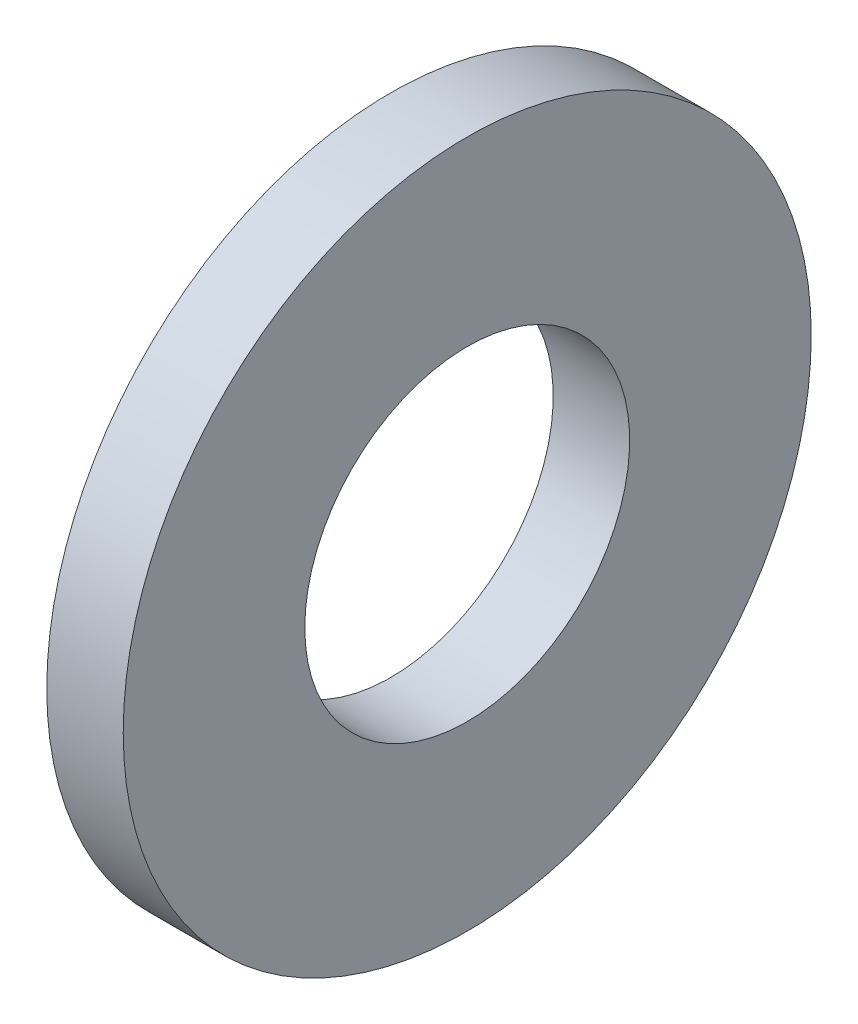
ISO-10303-21;
HEADER;
FILE_DESCRIPTION(('STEP AP214'),'2;1');
FILE_NAME('part.step','',(''),(''),'','','');
FILE_SCHEMA(('AUTOMOTIVE_DESIGN { 1 0 10303 214 1 1 1 1 }'));
ENDSEC;
DATA;
#1=APPLICATION_CONTEXT('core data for automotive mechanical design processes');
#2=APPLICATION_PROTOCOL_DEFINITION('international standard','automotive_design',2000,#1);
#3=PRODUCT_CONTEXT('',#1,'mechanical');
#4=PRODUCT('Part','Part','',(#3));
#5=PRODUCT_RELATED_PRODUCT_CATEGORY('part','',(#4));
#6=PRODUCT_DEFINITION_FORMATION('','',#4);
#7=PRODUCT_DEFINITION_CONTEXT('part definition',#1,'design');
#8=PRODUCT_DEFINITION('design','',#6,#7);
#9=PRODUCT_DEFINITION_SHAPE('','',#8);
#10=(LENGTH_UNIT() NAMED_UNIT(*) SI_UNIT(.MILLI.,.METRE.));
#11=(NAMED_UNIT(*) PLANE_ANGLE_UNIT() SI_UNIT($,.RADIAN.));
#12=(NAMED_UNIT(*) SI_UNIT($,.STERADIAN.) SOLID_ANGLE_UNIT());
#13=UNCERTAINTY_MEASURE_WITH_UNIT(LENGTH_MEASURE(1.E-05),#10,'distance_accuracy_value','');
#14=(GEOMETRIC_REPRESENTATION_CONTEXT(3) GLOBAL_UNCERTAINTY_ASSIGNED_CONTEXT((#13)) GLOBAL_UNIT_ASSIGNED_CONTEXT((#10,
#11,#12)) REPRESENTATION_CONTEXT('',''));
#15=CARTESIAN_POINT('',(0.,0.,0.));
#16=DIRECTION('',(0.,0.,1.));
#17=DIRECTION('',(1.,0.,0.));
#18=AXIS2_PLACEMENT_3D('',#15,#16,#17);
#19=CARTESIAN_POINT('',(479.425,38.1,0.));
#20=DIRECTION('',(1.,0.,0.));
#21=DIRECTION('',(0.,0.,-1.));
#22=AXIS2_PLACEMENT_3D('',#19,#20,#21);
#23=PLANE('',#22);
#24=CARTESIAN_POINT('',(479.425,38.1,0.));
#25=DIRECTION('',(-1.,0.,0.));
#26=DIRECTION('',(0.,0.,1.));
#27=AXIS2_PLACEMENT_3D('',#24,#25,#26);
#28=CIRCLE('',#27,6.746875);
#29=CARTESIAN_POINT('',(479.425,38.1,6.74687500000006));
#30=VERTEX_POINT('',#29);
#31=EDGE_CURVE('E26',#30,#30,#28,.T.);
#32=ORIENTED_EDGE('',*,*,#31,.T.);
#33=EDGE_LOOP('',(#32));
#34=FACE_BOUND('',#33,.T.);
#35=CARTESIAN_POINT('',(479.425,38.1,0.));
#36=DIRECTION('',(-1.,0.,0.));
#37=DIRECTION('',(0.,0.,1.));
#38=AXIS2_PLACEMENT_3D('',#35,#36,#37);
#39=CIRCLE('',#38,14.2875);
#40=CARTESIAN_POINT('',(479.425,38.1,14.2875000000001));
#41=VERTEX_POINT('',#40);
#42=EDGE_CURVE('E17',#41,#41,#39,.T.);
#43=ORIENTED_EDGE('',*,*,#42,.F.);
#44=EDGE_LOOP('',(#43));
#45=FACE_BOUND('',#44,.T.);
#46=ADVANCED_FACE('F14',(#34,#45),#23,.T.);
#47=CARTESIAN_POINT('',(479.425,38.1,0.));
#48=DIRECTION('',(-1.,0.,0.));
#49=DIRECTION('',(0.,0.,1.));
#50=AXIS2_PLACEMENT_3D('',#47,#48,#49);
#51=CYLINDRICAL_SURFACE('',#50,14.2875);
#52=ORIENTED_EDGE('',*,*,#42,.T.);
#53=EDGE_LOOP('',(#52));
#54=FACE_BOUND('',#53,.T.);
#55=CARTESIAN_POINT('',(476.25,38.1,0.));
#56=DIRECTION('',(-1.,0.,0.));
#57=DIRECTION('',(0.,0.,1.));
#58=AXIS2_PLACEMENT_3D('',#55,#56,#57);
#59=CIRCLE('',#58,14.2875);
#60=CARTESIAN_POINT('',(476.25,38.1,14.2875000000001));
#61=VERTEX_POINT('',#60);
#62=EDGE_CURVE('E21',#61,#61,#59,.F.);
#63=ORIENTED_EDGE('',*,*,#62,.T.);
#64=EDGE_LOOP('',(#63));
#65=FACE_BOUND('',#64,.T.);
#66=ADVANCED_FACE('F34',(#54,#65),#51,.T.);
#67=CARTESIAN_POINT('',(479.425,38.1,0.));
#68=DIRECTION('',(-1.,0.,0.));
#69=DIRECTION('',(0.,0.,1.));
#70=AXIS2_PLACEMENT_3D('',#67,#68,#69);
#71=CYLINDRICAL_SURFACE('',#70,6.746875);
#72=CARTESIAN_POINT('',(476.25,38.1,0.));
#73=DIRECTION('',(-1.,0.,0.));
#74=DIRECTION('',(0.,0.,1.));
#75=AXIS2_PLACEMENT_3D('',#72,#73,#74);
#76=CIRCLE('',#75,6.746875);
#77=CARTESIAN_POINT('',(476.25,38.1,6.74687500000006));
#78=VERTEX_POINT('',#77);
#79=EDGE_CURVE('E10',#78,#78,#76,.T.);
#80=ORIENTED_EDGE('',*,*,#79,.T.);
#81=EDGE_LOOP('',(#80));
#82=FACE_BOUND('',#81,.T.);
#83=ORIENTED_EDGE('',*,*,#31,.F.);
#84=EDGE_LOOP('',(#83));
#85=FACE_BOUND('',#84,.T.);
#86=ADVANCED_FACE('F42',(#82,#85),#71,.F.);
#87=CARTESIAN_POINT('',(476.25,38.1,0.));
#88=DIRECTION('',(1.,0.,0.));
#89=DIRECTION('',(0.,0.,-1.));
#90=AXIS2_PLACEMENT_3D('',#87,#88,#89);
#91=PLANE('',#90);
#92=ORIENTED_EDGE('',*,*,#79,.F.);
#93=EDGE_LOOP('',(#92));
#94=FACE_BOUND('',#93,.T.);
#95=ORIENTED_EDGE('',*,*,#62,.F.);
#96=EDGE_LOOP('',(#95));
#97=FACE_BOUND('',#96,.T.);
#98=ADVANCED_FACE('F43',(#94,#97),#91,.F.);
#99=CLOSED_SHELL('',(#46,#66,#86,#98));
#100=MANIFOLD_SOLID_BREP('B1',#99);
#101=ADVANCED_BREP_SHAPE_REPRESENTATION('',(#18,#100),#14);
#102=SHAPE_DEFINITION_REPRESENTATION(#9,#101);
ENDSEC;
END-ISO-10303-21;
